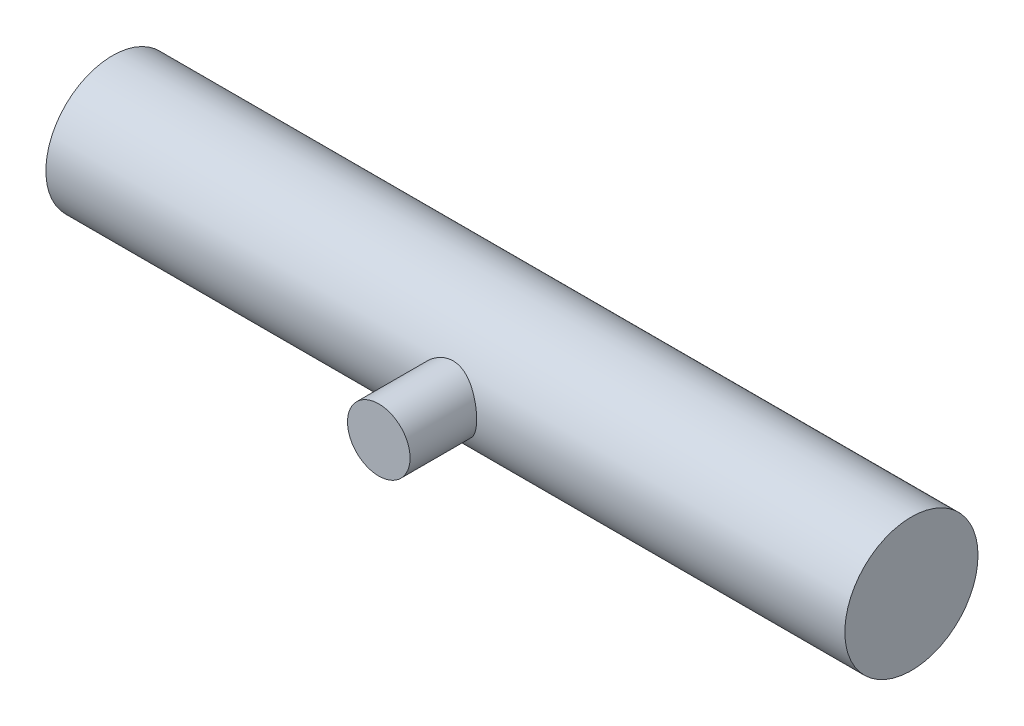
ISO-10303-21;
HEADER;
FILE_DESCRIPTION(('STEP AP214'),'2;1');
FILE_NAME('part.step','',(''),(''),'','','');
FILE_SCHEMA(('AUTOMOTIVE_DESIGN { 1 0 10303 214 1 1 1 1 }'));
ENDSEC;
DATA;
#1=APPLICATION_CONTEXT('core data for automotive mechanical design processes');
#2=APPLICATION_PROTOCOL_DEFINITION('international standard','automotive_design',2000,#1);
#3=PRODUCT_CONTEXT('',#1,'mechanical');
#4=PRODUCT('Part','Part','',(#3));
#5=PRODUCT_RELATED_PRODUCT_CATEGORY('part','',(#4));
#6=PRODUCT_DEFINITION_FORMATION('','',#4);
#7=PRODUCT_DEFINITION_CONTEXT('part definition',#1,'design');
#8=PRODUCT_DEFINITION('design','',#6,#7);
#9=PRODUCT_DEFINITION_SHAPE('','',#8);
#10=(LENGTH_UNIT() NAMED_UNIT(*) SI_UNIT(.MILLI.,.METRE.));
#11=(NAMED_UNIT(*) PLANE_ANGLE_UNIT() SI_UNIT($,.RADIAN.));
#12=(NAMED_UNIT(*) SI_UNIT($,.STERADIAN.) SOLID_ANGLE_UNIT());
#13=UNCERTAINTY_MEASURE_WITH_UNIT(LENGTH_MEASURE(1.E-05),#10,'distance_accuracy_value','');
#14=(GEOMETRIC_REPRESENTATION_CONTEXT(3) GLOBAL_UNCERTAINTY_ASSIGNED_CONTEXT((#13)) GLOBAL_UNIT_ASSIGNED_CONTEXT((#10,
#11,#12)) REPRESENTATION_CONTEXT('',''));
#15=CARTESIAN_POINT('',(0.,0.,0.));
#16=DIRECTION('',(0.,0.,1.));
#17=DIRECTION('',(1.,0.,0.));
#18=AXIS2_PLACEMENT_3D('',#15,#16,#17);
#19=CARTESIAN_POINT('',(30.,0.,0.));
#20=DIRECTION('',(-1.,0.,0.));
#21=DIRECTION('',(0.,0.,1.));
#22=AXIS2_PLACEMENT_3D('',#19,#20,#21);
#23=CYLINDRICAL_SURFACE('',#22,5.);
#24=CARTESIAN_POINT('',(30.,0.,0.));
#25=DIRECTION('',(1.,0.,0.));
#26=DIRECTION('',(0.,0.,-1.));
#27=AXIS2_PLACEMENT_3D('',#24,#25,#26);
#28=CIRCLE('',#27,5.);
#29=CARTESIAN_POINT('',(30.,0.,-5.));
#30=VERTEX_POINT('',#29);
#31=EDGE_CURVE('E44',#30,#30,#28,.T.);
#32=ORIENTED_EDGE('',*,*,#31,.F.);
#33=EDGE_LOOP('',(#32));
#34=FACE_BOUND('',#33,.T.);
#35=CARTESIAN_POINT('',(-30.,0.,0.));
#36=DIRECTION('',(1.,0.,0.));
#37=DIRECTION('',(0.,0.,-1.));
#38=AXIS2_PLACEMENT_3D('',#35,#36,#37);
#39=CIRCLE('',#38,5.);
#40=CARTESIAN_POINT('',(-30.,0.,-5.));
#41=VERTEX_POINT('',#40);
#42=EDGE_CURVE('E48',#41,#41,#39,.T.);
#43=ORIENTED_EDGE('',*,*,#42,.T.);
#44=EDGE_LOOP('',(#43));
#45=FACE_BOUND('',#44,.T.);
#46=CARTESIAN_POINT('',(2.35,0.,5.));
#47=CARTESIAN_POINT('',(2.34999200569439,0.124412653108522,4.99999336551646));
#48=CARTESIAN_POINT('',(2.34006119398578,0.249003820595048,4.99530502434079));
#49=CARTESIAN_POINT('',(2.3007489449155,0.494556192490973,4.97701260020809));
#50=CARTESIAN_POINT('',(2.271325000152,0.615508858731138,4.96338903343919));
#51=CARTESIAN_POINT('',(2.19440229116572,0.849851163723465,4.92866435258466));
#52=CARTESIAN_POINT('',(2.14697079782944,0.963267126642377,4.90759108830188));
#53=CARTESIAN_POINT('',(2.03570031213087,1.18038918471255,4.85994379076342));
#54=CARTESIAN_POINT('',(1.97186392282561,1.28409681678074,4.83337063033723));
#55=CARTESIAN_POINT('',(1.82555624157008,1.48531556411056,4.77549959231958));
#56=CARTESIAN_POINT('',(1.74224969913229,1.58216692913602,4.74402170749665));
#57=CARTESIAN_POINT('',(1.56114955997729,1.76111788576782,4.68054441887368));
#58=CARTESIAN_POINT('',(1.46334636200933,1.84320762026749,4.64854468204371));
#59=CARTESIAN_POINT('',(1.24820852471047,1.99574285755568,4.58522422236999));
#60=CARTESIAN_POINT('',(1.13000825889784,2.06505342814611,4.55408963332851));
#61=CARTESIAN_POINT('',(0.881983061350174,2.18252128754425,4.49898216541411));
#62=CARTESIAN_POINT('',(0.75216570940642,2.23069224988022,4.47500466041372));
#63=CARTESIAN_POINT('',(0.492118027494032,2.30161621908684,4.43892729191454));
#64=CARTESIAN_POINT('',(0.362322267841786,2.32564735549558,4.42623481684406));
#65=CARTESIAN_POINT('',(0.099969958014802,2.35156184952058,4.41252720128339));
#66=CARTESIAN_POINT('',(-0.032584304073337,2.35346288305292,4.41150274124584));
#67=CARTESIAN_POINT('',(-0.282112164057557,2.33600860749587,4.42076002515091));
#68=CARTESIAN_POINT('',(-0.399289165600532,2.31881383825636,4.42989272249219));
#69=CARTESIAN_POINT('',(-0.62884620287232,2.26735424273121,4.45644861496525));
#70=CARTESIAN_POINT('',(-0.741224971605691,2.23308493773181,4.47387398524193));
#71=CARTESIAN_POINT('',(-0.96113342428376,2.14778068813955,4.51545395296043));
#72=CARTESIAN_POINT('',(-1.0684908905756,2.09637638493231,4.53975483719312));
#73=CARTESIAN_POINT('',(-1.27354042254415,1.97853334904211,4.59233751095318));
#74=CARTESIAN_POINT('',(-1.37122821896089,1.91208801776712,4.62062104562945));
#75=CARTESIAN_POINT('',(-1.5655109581631,1.75748014771322,4.68176264040233));
#76=CARTESIAN_POINT('',(-1.66079652893613,1.66773047118991,4.71478114475792));
#77=CARTESIAN_POINT('',(-1.83547053601426,1.47330703481144,4.77910548765761));
#78=CARTESIAN_POINT('',(-1.91485299017519,1.36862768423651,4.81041067851245));
#79=CARTESIAN_POINT('',(-2.0581484098418,1.14240436721713,4.8691933496144));
#80=CARTESIAN_POINT('',(-2.12138877609089,1.02038334619765,4.89648877792408));
#81=CARTESIAN_POINT('',(-2.22596311073923,0.765822582149408,4.94269149547679));
#82=CARTESIAN_POINT('',(-2.26731251943406,0.633290329049226,4.96160469539895));
#83=CARTESIAN_POINT('',(-2.32386814840971,0.372279452575155,4.98771363489871));
#84=CARTESIAN_POINT('',(-2.34082231105902,0.244258173936759,4.99569061172278));
#85=CARTESIAN_POINT('',(-2.35348694869436,-0.0130427177118987,5.00163600252625));
#86=CARTESIAN_POINT('',(-2.34920583478486,-0.142321812265083,4.99960837924059));
#87=CARTESIAN_POINT('',(-2.32063393051877,-0.389342968741195,4.98625166811676));
#88=CARTESIAN_POINT('',(-2.29769519535712,-0.507279855380564,4.97555124754783));
#89=CARTESIAN_POINT('',(-2.23448824936179,-0.737434258314414,4.94668069783879));
#90=CARTESIAN_POINT('',(-2.19421802193213,-0.849651107357267,4.92850969947484));
#91=CARTESIAN_POINT('',(-2.09628493808528,-1.06909791011846,4.88568482228285));
#92=CARTESIAN_POINT('',(-2.03812895149562,-1.17607128161284,4.8608500772998));
#93=CARTESIAN_POINT('',(-1.90661512571593,-1.37911837440046,4.80719035691214));
#94=CARTESIAN_POINT('',(-1.83325061089483,-1.47518728053446,4.77836363111838));
#95=CARTESIAN_POINT('',(-1.66583759417655,-1.66272537407393,4.71655999252556));
#96=CARTESIAN_POINT('',(-1.57053024671684,-1.75302680717384,4.68344193318209));
#97=CARTESIAN_POINT('',(-1.36584612920283,-1.91680885503374,4.61883231861189));
#98=CARTESIAN_POINT('',(-1.25646240302627,-1.99028110307785,4.58734157841365));
#99=CARTESIAN_POINT('',(-1.0219046129144,-2.12056586679983,4.52863033206069));
#100=CARTESIAN_POINT('',(-0.896321053702228,-2.17672942099806,4.50159070572703));
#101=CARTESIAN_POINT('',(-0.635789932810472,-2.26653919896077,4.45705672968112));
#102=CARTESIAN_POINT('',(-0.500853099952321,-2.30021076574998,4.43955164097432));
#103=CARTESIAN_POINT('',(-0.238620834453659,-2.34126925781728,4.41802521839266));
#104=CARTESIAN_POINT('',(-0.11174511957579,-2.35076647528558,4.41292324069091));
#105=CARTESIAN_POINT('',(0.141817497633144,-2.34913731734412,4.41379213572917));
#106=CARTESIAN_POINT('',(0.268504444400607,-2.338016984998,4.41975976393583));
#107=CARTESIAN_POINT('',(0.508157585751066,-2.29737747299149,4.44100353587516));
#108=CARTESIAN_POINT('',(0.621440435410007,-2.26929994981566,4.45554838436247));
#109=CARTESIAN_POINT('',(0.841627600348602,-2.19717874462753,4.49154992003268));
#110=CARTESIAN_POINT('',(0.94852999376918,-2.15313027998718,4.51300867742711));
#111=CARTESIAN_POINT('',(1.16073708013679,-2.0469948619694,4.5621751321511));
#112=CARTESIAN_POINT('',(1.26546327784378,-1.98390352833406,4.59020338042023));
#113=CARTESIAN_POINT('',(1.46349061167646,-1.84268903989827,4.64869207930606));
#114=CARTESIAN_POINT('',(1.55678630408107,-1.76455876806753,4.67915367747306));
#115=CARTESIAN_POINT('',(1.73920369758873,-1.58605335418149,4.74281423379211));
#116=CARTESIAN_POINT('',(1.82692038260719,-1.48421977431191,4.7759741863774));
#117=CARTESIAN_POINT('',(1.98424089304535,-1.26624377669578,4.83833547601234));
#118=CARTESIAN_POINT('',(2.05383602261102,-1.15009452863961,4.86753490934959));
#119=CARTESIAN_POINT('',(2.17225535110829,-0.906638933375067,4.91867213939156));
#120=CARTESIAN_POINT('',(2.22116746557721,-0.779382641413925,4.94064058208668));
#121=CARTESIAN_POINT('',(2.27755301616835,-0.583013324118671,4.96633524682656));
#122=CARTESIAN_POINT('',(2.29351200067067,-0.516695834731675,4.97368759695101));
#123=CARTESIAN_POINT('',(2.31962921580788,-0.382708486029145,4.98578386943816));
#124=CARTESIAN_POINT('',(2.32979125909285,-0.315039545949611,4.9905295061607));
#125=CARTESIAN_POINT('',(2.34131519713447,-0.206018724191074,4.99592268754526));
#126=CARTESIAN_POINT('',(2.34456951700894,-0.164899163628452,4.99744939816408));
#127=CARTESIAN_POINT('',(2.34891326734663,-0.0825262859362392,4.99948916557426));
#128=CARTESIAN_POINT('',(2.35000265205102,-0.0412729659979221,5.00000220094023));
#129=CARTESIAN_POINT('',(2.35,0.,5.));
#130=B_SPLINE_CURVE_WITH_KNOTS('',3,(#46,#47,#48,#49,#50,#51,#52,#53,#54,#55,#56,#57,#58,#59,
#60,#61,#62,#63,#64,#65,#66,#67,#68,#69,#70,#71,#72,#73,#74,#75,#76,#77,#78,#79,#80,#81,#82,#83,
#84,#85,#86,#87,#88,#89,#90,#91,#92,#93,#94,#95,#96,#97,#98,#99,#100,#101,#102,#103,#104,#105,
#106,#107,#108,#109,#110,#111,#112,#113,#114,#115,#116,#117,#118,#119,#120,#121,#122,#123,#124,
#125,#126,#127,#128,#129),.UNSPECIFIED.,.T.,.F.,(4,2,2,2,2,2,2,2,2,2,2,2,2,2,2,2,2,2,2,2,2,2,2,
2,2,2,2,2,2,2,2,2,2,2,2,2,2,2,2,2,2,4),(0.,0.373077104103368,0.746970442761133,1.11948055510286,
1.49193159562916,1.88497782063875,2.27828553621306,2.69770582866127,3.11685443023877,
3.51240945875345,3.9076485249925,4.26234267702275,4.61712991565768,4.9801211241254,
5.34327188877116,5.74648382357669,6.14984714766962,6.56797505567776,6.98580765230911,
7.37188719699511,7.75781383121621,8.11802984543217,8.47828778371484,8.8495363959413,
9.22094831038554,9.62537166099799,10.0299956384613,10.4483319095578,10.8661960182528,
11.2460920280898,11.6258767069073,11.9771928449731,12.3286142745153,12.7033940957341,
13.0783517158386,13.4916940935506,13.9052344547306,14.3169989016807,14.5225652322169,
14.7279962053683,14.8517591249782,14.9755246604566),.UNSPECIFIED.);
#131=CARTESIAN_POINT('',(2.35,0.,5.));
#132=VERTEX_POINT('',#131);
#133=EDGE_CURVE('E10',#132,#132,#130,.T.);
#134=ORIENTED_EDGE('',*,*,#133,.F.);
#135=EDGE_LOOP('',(#134));
#136=FACE_BOUND('',#135,.T.);
#137=ADVANCED_FACE('F33',(#34,#45,#136),#23,.T.);
#138=CARTESIAN_POINT('',(30.,0.,0.));
#139=DIRECTION('',(1.,0.,0.));
#140=DIRECTION('',(0.,0.,-1.));
#141=AXIS2_PLACEMENT_3D('',#138,#139,#140);
#142=PLANE('',#141);
#143=ORIENTED_EDGE('',*,*,#31,.T.);
#144=EDGE_LOOP('',(#143));
#145=FACE_BOUND('',#144,.T.);
#146=ADVANCED_FACE('F68',(#145),#142,.T.);
#147=CARTESIAN_POINT('',(-30.,0.,0.));
#148=DIRECTION('',(1.,0.,0.));
#149=DIRECTION('',(0.,0.,-1.));
#150=AXIS2_PLACEMENT_3D('',#147,#148,#149);
#151=PLANE('',#150);
#152=ORIENTED_EDGE('',*,*,#42,.F.);
#153=EDGE_LOOP('',(#152));
#154=FACE_BOUND('',#153,.T.);
#155=ADVANCED_FACE('F62',(#154),#151,.F.);
#156=CARTESIAN_POINT('',(0.,0.,10.));
#157=DIRECTION('',(0.,0.,-1.));
#158=DIRECTION('',(-1.,0.,0.));
#159=AXIS2_PLACEMENT_3D('',#156,#157,#158);
#160=CYLINDRICAL_SURFACE('',#159,2.35);
#161=CARTESIAN_POINT('',(0.,0.,10.));
#162=DIRECTION('',(0.,0.,1.));
#163=DIRECTION('',(1.,0.,0.));
#164=AXIS2_PLACEMENT_3D('',#161,#162,#163);
#165=CIRCLE('',#164,2.35);
#166=CARTESIAN_POINT('',(2.35,0.,10.));
#167=VERTEX_POINT('',#166);
#168=EDGE_CURVE('E53',#167,#167,#165,.T.);
#169=ORIENTED_EDGE('',*,*,#168,.F.);
#170=EDGE_LOOP('',(#169));
#171=FACE_BOUND('',#170,.T.);
#172=ORIENTED_EDGE('',*,*,#133,.T.);
#173=EDGE_LOOP('',(#172));
#174=FACE_BOUND('',#173,.T.);
#175=ADVANCED_FACE('F60',(#171,#174),#160,.T.);
#176=CARTESIAN_POINT('',(0.,0.,10.));
#177=DIRECTION('',(0.,0.,1.));
#178=DIRECTION('',(1.,0.,0.));
#179=AXIS2_PLACEMENT_3D('',#176,#177,#178);
#180=PLANE('',#179);
#181=ORIENTED_EDGE('',*,*,#168,.T.);
#182=EDGE_LOOP('',(#181));
#183=FACE_BOUND('',#182,.T.);
#184=ADVANCED_FACE('F58',(#183),#180,.T.);
#185=CLOSED_SHELL('',(#137,#146,#155,#175,#184));
#186=MANIFOLD_SOLID_BREP('B2',#185);
#187=ADVANCED_BREP_SHAPE_REPRESENTATION('',(#18,#186),#14);
#188=SHAPE_DEFINITION_REPRESENTATION(#9,#187);
ENDSEC;
END-ISO-10303-21;
